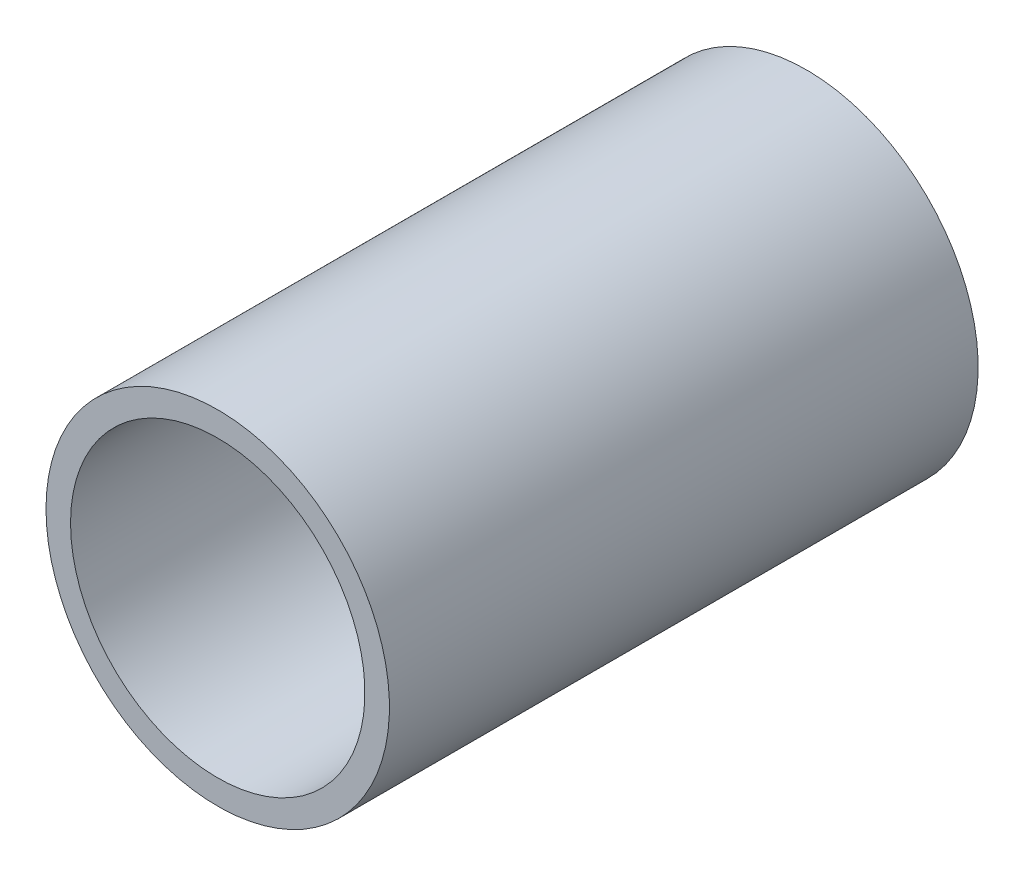
ISO-10303-21;
HEADER;
FILE_DESCRIPTION(('STEP AP214'),'2;1');
FILE_NAME('part.step','',(''),(''),'','','');
FILE_SCHEMA(('AUTOMOTIVE_DESIGN { 1 0 10303 214 1 1 1 1 }'));
ENDSEC;
DATA;
#1=APPLICATION_CONTEXT('core data for automotive mechanical design processes');
#2=APPLICATION_PROTOCOL_DEFINITION('international standard','automotive_design',2000,#1);
#3=PRODUCT_CONTEXT('',#1,'mechanical');
#4=PRODUCT('Part','Part','',(#3));
#5=PRODUCT_RELATED_PRODUCT_CATEGORY('part','',(#4));
#6=PRODUCT_DEFINITION_FORMATION('','',#4);
#7=PRODUCT_DEFINITION_CONTEXT('part definition',#1,'design');
#8=PRODUCT_DEFINITION('design','',#6,#7);
#9=PRODUCT_DEFINITION_SHAPE('','',#8);
#10=(LENGTH_UNIT() NAMED_UNIT(*) SI_UNIT(.MILLI.,.METRE.));
#11=(NAMED_UNIT(*) PLANE_ANGLE_UNIT() SI_UNIT($,.RADIAN.));
#12=(NAMED_UNIT(*) SI_UNIT($,.STERADIAN.) SOLID_ANGLE_UNIT());
#13=UNCERTAINTY_MEASURE_WITH_UNIT(LENGTH_MEASURE(1.E-05),#10,'distance_accuracy_value','');
#14=(GEOMETRIC_REPRESENTATION_CONTEXT(3) GLOBAL_UNCERTAINTY_ASSIGNED_CONTEXT((#13)) GLOBAL_UNIT_ASSIGNED_CONTEXT((#10,
#11,#12)) REPRESENTATION_CONTEXT('',''));
#15=CARTESIAN_POINT('',(0.,0.,0.));
#16=DIRECTION('',(0.,0.,1.));
#17=DIRECTION('',(1.,0.,0.));
#18=AXIS2_PLACEMENT_3D('',#15,#16,#17);
#19=CARTESIAN_POINT('',(-11.1363372188061,23.8205232042179,152.4));
#20=DIRECTION('',(0.,0.,1.));
#21=DIRECTION('',(1.,0.,0.));
#22=AXIS2_PLACEMENT_3D('',#19,#20,#21);
#23=PLANE('',#22);
#24=CARTESIAN_POINT('',(-11.1363372188061,23.8205232042179,152.4));
#25=DIRECTION('',(0.,0.,1.));
#26=DIRECTION('',(1.,0.,0.));
#27=AXIS2_PLACEMENT_3D('',#24,#25,#26);
#28=CIRCLE('',#27,44.45);
#29=CARTESIAN_POINT('',(-55.5863372188061,23.8205232042179,152.4));
#30=VERTEX_POINT('',#29);
#31=EDGE_CURVE('E10',#30,#30,#28,.T.);
#32=ORIENTED_EDGE('',*,*,#31,.T.);
#33=EDGE_LOOP('',(#32));
#34=FACE_BOUND('',#33,.T.);
#35=CARTESIAN_POINT('',(-11.1363372188061,23.8205232042179,152.4));
#36=DIRECTION('',(0.,0.,1.));
#37=DIRECTION('',(1.,0.,0.));
#38=AXIS2_PLACEMENT_3D('',#35,#36,#37);
#39=CIRCLE('',#38,38.1);
#40=CARTESIAN_POINT('',(-49.2363372188061,23.8205232042179,152.4));
#41=VERTEX_POINT('',#40);
#42=EDGE_CURVE('E42',#41,#41,#39,.T.);
#43=ORIENTED_EDGE('',*,*,#42,.F.);
#44=EDGE_LOOP('',(#43));
#45=FACE_BOUND('',#44,.T.);
#46=ADVANCED_FACE('F31',(#34,#45),#23,.T.);
#47=CARTESIAN_POINT('',(-11.1363372188061,23.8205232042179,0.));
#48=DIRECTION('',(0.,0.,1.));
#49=DIRECTION('',(1.,0.,0.));
#50=AXIS2_PLACEMENT_3D('',#47,#48,#49);
#51=PLANE('',#50);
#52=CARTESIAN_POINT('',(-11.1363372188061,23.8205232042179,0.));
#53=DIRECTION('',(0.,0.,1.));
#54=DIRECTION('',(1.,0.,0.));
#55=AXIS2_PLACEMENT_3D('',#52,#53,#54);
#56=CIRCLE('',#55,44.45);
#57=CARTESIAN_POINT('',(-55.5863372188061,23.8205232042179,0.));
#58=VERTEX_POINT('',#57);
#59=EDGE_CURVE('E35',#58,#58,#56,.T.);
#60=ORIENTED_EDGE('',*,*,#59,.F.);
#61=EDGE_LOOP('',(#60));
#62=FACE_BOUND('',#61,.T.);
#63=CARTESIAN_POINT('',(-11.1363372188061,23.8205232042179,0.));
#64=DIRECTION('',(0.,0.,1.));
#65=DIRECTION('',(1.,0.,0.));
#66=AXIS2_PLACEMENT_3D('',#63,#64,#65);
#67=CIRCLE('',#66,38.1);
#68=CARTESIAN_POINT('',(-49.2363372188061,23.8205232042179,0.));
#69=VERTEX_POINT('',#68);
#70=EDGE_CURVE('E44',#69,#69,#67,.T.);
#71=ORIENTED_EDGE('',*,*,#70,.T.);
#72=EDGE_LOOP('',(#71));
#73=FACE_BOUND('',#72,.T.);
#74=ADVANCED_FACE('F54',(#62,#73),#51,.F.);
#75=CARTESIAN_POINT('',(-11.1363372188061,23.8205232042179,152.4));
#76=DIRECTION('',(0.,0.,-1.));
#77=DIRECTION('',(-1.,0.,0.));
#78=AXIS2_PLACEMENT_3D('',#75,#76,#77);
#79=CYLINDRICAL_SURFACE('',#78,44.45);
#80=CARTESIAN_POINT('',(-55.5863372188061,23.8205232042179,152.4));
#81=CARTESIAN_POINT('',(-55.5863372188061,23.8205232042179,150.8125));
#82=CARTESIAN_POINT('',(-55.5863372188061,23.8205232042179,149.225));
#83=CARTESIAN_POINT('',(-55.5863372188061,23.8205232042179,146.05));
#84=CARTESIAN_POINT('',(-55.5863372188061,23.8205232042179,144.4625));
#85=CARTESIAN_POINT('',(-55.5863372188061,23.8205232042179,141.2875));
#86=CARTESIAN_POINT('',(-55.5863372188061,23.8205232042179,139.7));
#87=CARTESIAN_POINT('',(-55.5863372188061,23.8205232042179,136.525));
#88=CARTESIAN_POINT('',(-55.5863372188061,23.8205232042179,134.9375));
#89=CARTESIAN_POINT('',(-55.5863372188061,23.8205232042179,131.7625));
#90=CARTESIAN_POINT('',(-55.5863372188061,23.8205232042179,130.175));
#91=CARTESIAN_POINT('',(-55.5863372188061,23.8205232042179,127.));
#92=CARTESIAN_POINT('',(-55.5863372188061,23.8205232042179,125.4125));
#93=CARTESIAN_POINT('',(-55.5863372188061,23.8205232042179,122.2375));
#94=CARTESIAN_POINT('',(-55.5863372188061,23.8205232042179,120.65));
#95=CARTESIAN_POINT('',(-55.5863372188061,23.8205232042179,117.475));
#96=CARTESIAN_POINT('',(-55.5863372188061,23.8205232042179,115.8875));
#97=CARTESIAN_POINT('',(-55.5863372188061,23.8205232042179,112.7125));
#98=CARTESIAN_POINT('',(-55.5863372188061,23.8205232042179,111.125));
#99=CARTESIAN_POINT('',(-55.5863372188061,23.8205232042179,107.95));
#100=CARTESIAN_POINT('',(-55.5863372188061,23.8205232042179,106.3625));
#101=CARTESIAN_POINT('',(-55.5863372188061,23.8205232042179,103.1875));
#102=CARTESIAN_POINT('',(-55.5863372188061,23.8205232042179,101.6));
#103=CARTESIAN_POINT('',(-55.5863372188061,23.8205232042179,98.425));
#104=CARTESIAN_POINT('',(-55.5863372188061,23.8205232042179,96.8375));
#105=CARTESIAN_POINT('',(-55.5863372188061,23.8205232042179,93.6625));
#106=CARTESIAN_POINT('',(-55.5863372188061,23.8205232042179,92.075));
#107=CARTESIAN_POINT('',(-55.5863372188061,23.8205232042179,88.9));
#108=CARTESIAN_POINT('',(-55.5863372188061,23.8205232042179,87.3125));
#109=CARTESIAN_POINT('',(-55.5863372188061,23.8205232042179,84.1375));
#110=CARTESIAN_POINT('',(-55.5863372188061,23.8205232042179,82.55));
#111=CARTESIAN_POINT('',(-55.5863372188061,23.8205232042179,79.375));
#112=CARTESIAN_POINT('',(-55.5863372188061,23.8205232042179,77.7875));
#113=CARTESIAN_POINT('',(-55.5863372188061,23.8205232042179,74.6125));
#114=CARTESIAN_POINT('',(-55.5863372188061,23.8205232042179,73.025));
#115=CARTESIAN_POINT('',(-55.5863372188061,23.8205232042179,69.85));
#116=CARTESIAN_POINT('',(-55.5863372188061,23.8205232042179,68.2625));
#117=CARTESIAN_POINT('',(-55.5863372188061,23.8205232042179,65.0875));
#118=CARTESIAN_POINT('',(-55.5863372188061,23.8205232042179,63.5));
#119=CARTESIAN_POINT('',(-55.5863372188061,23.8205232042179,60.325));
#120=CARTESIAN_POINT('',(-55.5863372188061,23.8205232042179,58.7375));
#121=CARTESIAN_POINT('',(-55.5863372188061,23.8205232042179,55.5625));
#122=CARTESIAN_POINT('',(-55.5863372188061,23.8205232042179,53.975));
#123=CARTESIAN_POINT('',(-55.5863372188061,23.8205232042179,50.8));
#124=CARTESIAN_POINT('',(-55.5863372188061,23.8205232042179,49.2125));
#125=CARTESIAN_POINT('',(-55.5863372188061,23.8205232042179,46.0375));
#126=CARTESIAN_POINT('',(-55.5863372188061,23.8205232042179,44.45));
#127=CARTESIAN_POINT('',(-55.5863372188061,23.8205232042179,41.275));
#128=CARTESIAN_POINT('',(-55.5863372188061,23.8205232042179,39.6875));
#129=CARTESIAN_POINT('',(-55.5863372188061,23.8205232042179,36.5125));
#130=CARTESIAN_POINT('',(-55.5863372188061,23.8205232042179,34.925));
#131=CARTESIAN_POINT('',(-55.5863372188061,23.8205232042179,31.75));
#132=CARTESIAN_POINT('',(-55.5863372188061,23.8205232042179,30.1625));
#133=CARTESIAN_POINT('',(-55.5863372188061,23.8205232042179,26.9875));
#134=CARTESIAN_POINT('',(-55.5863372188061,23.8205232042179,25.4));
#135=CARTESIAN_POINT('',(-55.5863372188061,23.8205232042179,22.225));
#136=CARTESIAN_POINT('',(-55.5863372188061,23.8205232042179,20.6375));
#137=CARTESIAN_POINT('',(-55.5863372188061,23.8205232042179,17.4625));
#138=CARTESIAN_POINT('',(-55.5863372188061,23.8205232042179,15.875));
#139=CARTESIAN_POINT('',(-55.5863372188061,23.8205232042179,12.7));
#140=CARTESIAN_POINT('',(-55.5863372188061,23.8205232042179,11.1125));
#141=CARTESIAN_POINT('',(-55.5863372188061,23.8205232042179,7.93750000000001));
#142=CARTESIAN_POINT('',(-55.5863372188061,23.8205232042179,6.35));
#143=CARTESIAN_POINT('',(-55.5863372188061,23.8205232042179,3.175));
#144=CARTESIAN_POINT('',(-55.5863372188061,23.8205232042179,1.5875));
#145=CARTESIAN_POINT('',(-55.5863372188061,23.8205232042179,0.));
#146=B_SPLINE_CURVE_WITH_KNOTS('',3,(#80,#81,#82,#83,#84,#85,#86,#87,#88,#89,#90,#91,#92,#93,
#94,#95,#96,#97,#98,#99,#100,#101,#102,#103,#104,#105,#106,#107,#108,#109,#110,#111,#112,#113,
#114,#115,#116,#117,#118,#119,#120,#121,#122,#123,#124,#125,#126,#127,#128,#129,#130,#131,#132,
#133,#134,#135,#136,#137,#138,#139,#140,#141,#142,#143,#144,#145),.UNSPECIFIED.,.F.,.F.,(4,2,2,
2,2,2,2,2,2,2,2,2,2,2,2,2,2,2,2,2,2,2,2,2,2,2,2,2,2,2,2,2,4),(0.,4.76249999999998,
9.52499999999998,14.2875,19.05,23.8125,28.575,33.3375,38.1,42.8625,47.625,52.3875,57.15,61.9125,
66.675,71.4375,76.2,80.9625,85.725,90.4875,95.25,100.0125,104.775,109.5375,114.3,119.0625,
123.825,128.5875,133.35,138.1125,142.875,147.6375,152.4),.UNSPECIFIED.);
#147=EDGE_CURVE('BSEAM33',#30,#58,#146,.T.);
#148=ORIENTED_EDGE('',*,*,#31,.F.);
#149=ORIENTED_EDGE('',*,*,#59,.T.);
#150=ORIENTED_EDGE('',*,*,#147,.T.);
#151=ORIENTED_EDGE('',*,*,#147,.F.);
#152=EDGE_LOOP('',(#148,#150,#149,#151));
#153=FACE_BOUND('',#152,.T.);
#154=ADVANCED_FACE('F33',(#153),#79,.T.);
#155=CARTESIAN_POINT('',(-11.1363372188061,23.8205232042179,152.4));
#156=DIRECTION('',(0.,0.,-1.));
#157=DIRECTION('',(-1.,0.,0.));
#158=AXIS2_PLACEMENT_3D('',#155,#156,#157);
#159=CYLINDRICAL_SURFACE('',#158,38.1);
#160=CARTESIAN_POINT('',(-49.2363372188061,23.8205232042179,152.4));
#161=CARTESIAN_POINT('',(-49.2363372188061,23.8205232042179,150.8125));
#162=CARTESIAN_POINT('',(-49.2363372188061,23.8205232042179,149.225));
#163=CARTESIAN_POINT('',(-49.2363372188061,23.8205232042179,146.05));
#164=CARTESIAN_POINT('',(-49.2363372188061,23.8205232042179,144.4625));
#165=CARTESIAN_POINT('',(-49.2363372188061,23.8205232042179,141.2875));
#166=CARTESIAN_POINT('',(-49.2363372188061,23.8205232042179,139.7));
#167=CARTESIAN_POINT('',(-49.2363372188061,23.8205232042179,136.525));
#168=CARTESIAN_POINT('',(-49.2363372188061,23.8205232042179,134.9375));
#169=CARTESIAN_POINT('',(-49.2363372188061,23.8205232042179,131.7625));
#170=CARTESIAN_POINT('',(-49.2363372188061,23.8205232042179,130.175));
#171=CARTESIAN_POINT('',(-49.2363372188061,23.8205232042179,127.));
#172=CARTESIAN_POINT('',(-49.2363372188061,23.8205232042179,125.4125));
#173=CARTESIAN_POINT('',(-49.2363372188061,23.8205232042179,122.2375));
#174=CARTESIAN_POINT('',(-49.2363372188061,23.8205232042179,120.65));
#175=CARTESIAN_POINT('',(-49.2363372188061,23.8205232042179,117.475));
#176=CARTESIAN_POINT('',(-49.2363372188061,23.8205232042179,115.8875));
#177=CARTESIAN_POINT('',(-49.2363372188061,23.8205232042179,112.7125));
#178=CARTESIAN_POINT('',(-49.2363372188061,23.8205232042179,111.125));
#179=CARTESIAN_POINT('',(-49.2363372188061,23.8205232042179,107.95));
#180=CARTESIAN_POINT('',(-49.2363372188061,23.8205232042179,106.3625));
#181=CARTESIAN_POINT('',(-49.2363372188061,23.8205232042179,103.1875));
#182=CARTESIAN_POINT('',(-49.2363372188061,23.8205232042179,101.6));
#183=CARTESIAN_POINT('',(-49.2363372188061,23.8205232042179,98.425));
#184=CARTESIAN_POINT('',(-49.2363372188061,23.8205232042179,96.8375));
#185=CARTESIAN_POINT('',(-49.2363372188061,23.8205232042179,93.6625));
#186=CARTESIAN_POINT('',(-49.2363372188061,23.8205232042179,92.075));
#187=CARTESIAN_POINT('',(-49.2363372188061,23.8205232042179,88.9));
#188=CARTESIAN_POINT('',(-49.2363372188061,23.8205232042179,87.3125));
#189=CARTESIAN_POINT('',(-49.2363372188061,23.8205232042179,84.1375));
#190=CARTESIAN_POINT('',(-49.2363372188061,23.8205232042179,82.55));
#191=CARTESIAN_POINT('',(-49.2363372188061,23.8205232042179,79.375));
#192=CARTESIAN_POINT('',(-49.2363372188061,23.8205232042179,77.7875));
#193=CARTESIAN_POINT('',(-49.2363372188061,23.8205232042179,74.6125));
#194=CARTESIAN_POINT('',(-49.2363372188061,23.8205232042179,73.025));
#195=CARTESIAN_POINT('',(-49.2363372188061,23.8205232042179,69.85));
#196=CARTESIAN_POINT('',(-49.2363372188061,23.8205232042179,68.2625));
#197=CARTESIAN_POINT('',(-49.2363372188061,23.8205232042179,65.0875));
#198=CARTESIAN_POINT('',(-49.2363372188061,23.8205232042179,63.5));
#199=CARTESIAN_POINT('',(-49.2363372188061,23.8205232042179,60.325));
#200=CARTESIAN_POINT('',(-49.2363372188061,23.8205232042179,58.7375));
#201=CARTESIAN_POINT('',(-49.2363372188061,23.8205232042179,55.5625));
#202=CARTESIAN_POINT('',(-49.2363372188061,23.8205232042179,53.975));
#203=CARTESIAN_POINT('',(-49.2363372188061,23.8205232042179,50.8));
#204=CARTESIAN_POINT('',(-49.2363372188061,23.8205232042179,49.2125));
#205=CARTESIAN_POINT('',(-49.2363372188061,23.8205232042179,46.0375));
#206=CARTESIAN_POINT('',(-49.2363372188061,23.8205232042179,44.45));
#207=CARTESIAN_POINT('',(-49.2363372188061,23.8205232042179,41.275));
#208=CARTESIAN_POINT('',(-49.2363372188061,23.8205232042179,39.6875));
#209=CARTESIAN_POINT('',(-49.2363372188061,23.8205232042179,36.5125));
#210=CARTESIAN_POINT('',(-49.2363372188061,23.8205232042179,34.925));
#211=CARTESIAN_POINT('',(-49.2363372188061,23.8205232042179,31.75));
#212=CARTESIAN_POINT('',(-49.2363372188061,23.8205232042179,30.1625));
#213=CARTESIAN_POINT('',(-49.2363372188061,23.8205232042179,26.9875));
#214=CARTESIAN_POINT('',(-49.2363372188061,23.8205232042179,25.4));
#215=CARTESIAN_POINT('',(-49.2363372188061,23.8205232042179,22.225));
#216=CARTESIAN_POINT('',(-49.2363372188061,23.8205232042179,20.6375));
#217=CARTESIAN_POINT('',(-49.2363372188061,23.8205232042179,17.4625));
#218=CARTESIAN_POINT('',(-49.2363372188061,23.8205232042179,15.875));
#219=CARTESIAN_POINT('',(-49.2363372188061,23.8205232042179,12.7));
#220=CARTESIAN_POINT('',(-49.2363372188061,23.8205232042179,11.1125));
#221=CARTESIAN_POINT('',(-49.2363372188061,23.8205232042179,7.93750000000001));
#222=CARTESIAN_POINT('',(-49.2363372188061,23.8205232042179,6.35));
#223=CARTESIAN_POINT('',(-49.2363372188061,23.8205232042179,3.175));
#224=CARTESIAN_POINT('',(-49.2363372188061,23.8205232042179,1.5875));
#225=CARTESIAN_POINT('',(-49.2363372188061,23.8205232042179,0.));
#226=B_SPLINE_CURVE_WITH_KNOTS('',3,(#160,#161,#162,#163,#164,#165,#166,#167,#168,#169,#170,
#171,#172,#173,#174,#175,#176,#177,#178,#179,#180,#181,#182,#183,#184,#185,#186,#187,#188,#189,
#190,#191,#192,#193,#194,#195,#196,#197,#198,#199,#200,#201,#202,#203,#204,#205,#206,#207,#208,
#209,#210,#211,#212,#213,#214,#215,#216,#217,#218,#219,#220,#221,#222,#223,#224,#225),
.UNSPECIFIED.,.F.,.F.,(4,2,2,2,2,2,2,2,2,2,2,2,2,2,2,2,2,2,2,2,2,2,2,2,2,2,2,2,2,2,2,2,4),(0.,
4.7625,9.52500000000001,14.2875,19.05,23.8125,28.575,33.3375,38.1,42.8625,47.625,52.3875,57.15,
61.9125,66.675,71.4375,76.2,80.9625,85.725,90.4875,95.25,100.0125,104.775,109.5375,114.3,
119.0625,123.825,128.5875,133.35,138.1125,142.875,147.6375,152.4),.UNSPECIFIED.);
#227=EDGE_CURVE('BSEAM50',#41,#69,#226,.T.);
#228=ORIENTED_EDGE('',*,*,#42,.T.);
#229=ORIENTED_EDGE('',*,*,#70,.F.);
#230=ORIENTED_EDGE('',*,*,#227,.T.);
#231=ORIENTED_EDGE('',*,*,#227,.F.);
#232=EDGE_LOOP('',(#228,#230,#229,#231));
#233=FACE_BOUND('',#232,.T.);
#234=ADVANCED_FACE('F50',(#233),#159,.F.);
#235=CLOSED_SHELL('',(#46,#74,#154,#234));
#236=MANIFOLD_SOLID_BREP('B2',#235);
#237=ADVANCED_BREP_SHAPE_REPRESENTATION('',(#18,#236),#14);
#238=SHAPE_DEFINITION_REPRESENTATION(#9,#237);
ENDSEC;
END-ISO-10303-21;
